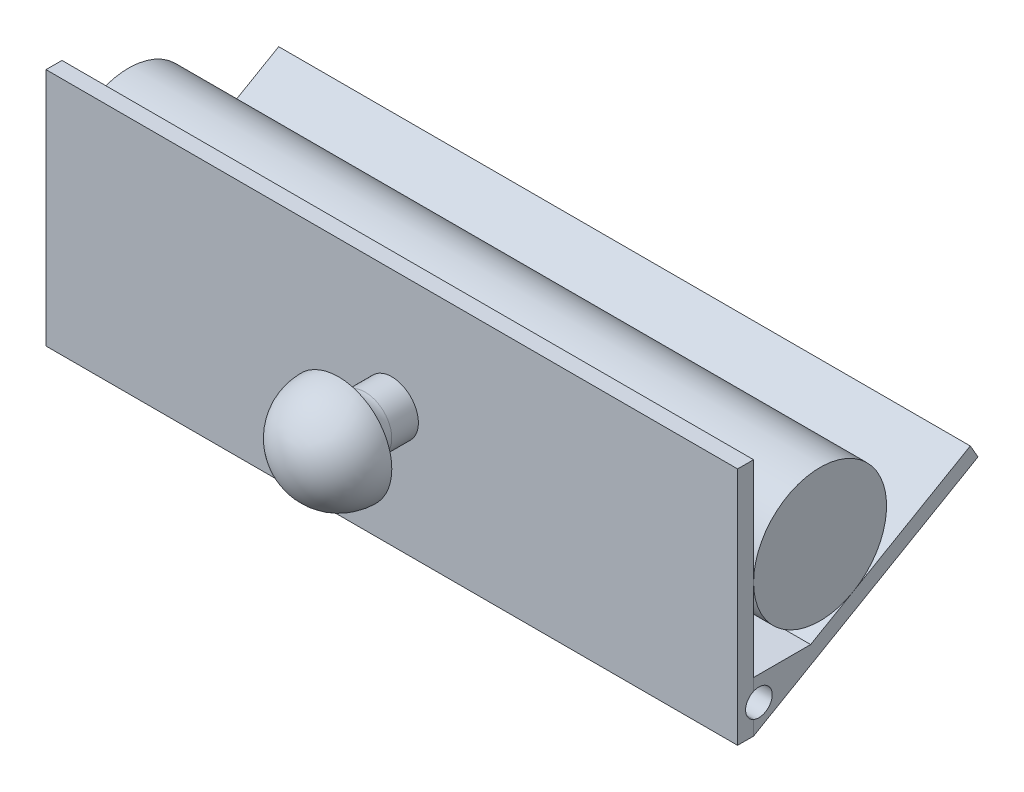
ISO-10303-21;
HEADER;
FILE_DESCRIPTION(('STEP AP214'),'2;1');
FILE_NAME('part.step','',(''),(''),'','','');
FILE_SCHEMA(('AUTOMOTIVE_DESIGN { 1 0 10303 214 1 1 1 1 }'));
ENDSEC;
DATA;
#1=APPLICATION_CONTEXT('core data for automotive mechanical design processes');
#2=APPLICATION_PROTOCOL_DEFINITION('international standard','automotive_design',2000,#1);
#3=PRODUCT_CONTEXT('',#1,'mechanical');
#4=PRODUCT('Part','Part','',(#3));
#5=PRODUCT_RELATED_PRODUCT_CATEGORY('part','',(#4));
#6=PRODUCT_DEFINITION_FORMATION('','',#4);
#7=PRODUCT_DEFINITION_CONTEXT('part definition',#1,'design');
#8=PRODUCT_DEFINITION('design','',#6,#7);
#9=PRODUCT_DEFINITION_SHAPE('','',#8);
#10=(LENGTH_UNIT() NAMED_UNIT(*) SI_UNIT(.MILLI.,.METRE.));
#11=(NAMED_UNIT(*) PLANE_ANGLE_UNIT() SI_UNIT($,.RADIAN.));
#12=(NAMED_UNIT(*) SI_UNIT($,.STERADIAN.) SOLID_ANGLE_UNIT());
#13=UNCERTAINTY_MEASURE_WITH_UNIT(LENGTH_MEASURE(1.E-05),#10,'distance_accuracy_value','');
#14=(GEOMETRIC_REPRESENTATION_CONTEXT(3) GLOBAL_UNCERTAINTY_ASSIGNED_CONTEXT((#13)) GLOBAL_UNIT_ASSIGNED_CONTEXT((#10,
#11,#12)) REPRESENTATION_CONTEXT('',''));
#15=CARTESIAN_POINT('',(0.,0.,0.));
#16=DIRECTION('',(0.,0.,1.));
#17=DIRECTION('',(1.,0.,0.));
#18=AXIS2_PLACEMENT_3D('',#15,#16,#17);
#19=CARTESIAN_POINT('',(130.,0.,0.));
#20=DIRECTION('',(0.,0.,-1.));
#21=DIRECTION('',(-1.,0.,0.));
#22=AXIS2_PLACEMENT_3D('',#19,#20,#21);
#23=PLANE('',#22);
#24=DIRECTION('',(0.,-1.,0.));
#25=VECTOR('',#24,1.);
#26=CARTESIAN_POINT('',(130.,0.,0.));
#27=LINE('',#26,#25);
#28=CARTESIAN_POINT('',(130.,2.70871215252208,0.));
#29=VERTEX_POINT('',#28);
#30=CARTESIAN_POINT('',(130.,0.,0.));
#31=VERTEX_POINT('',#30);
#32=EDGE_CURVE('E145',#29,#31,#27,.T.);
#33=ORIENTED_EDGE('',*,*,#32,.F.);
#34=DIRECTION('',(-1.,0.,0.));
#35=VECTOR('',#34,1.);
#36=CARTESIAN_POINT('',(130.,2.70871215252208,0.));
#37=LINE('',#36,#35);
#38=CARTESIAN_POINT('',(0.,2.70871215252208,0.));
#39=VERTEX_POINT('',#38);
#40=EDGE_CURVE('E172',#29,#39,#37,.T.);
#41=ORIENTED_EDGE('',*,*,#40,.T.);
#42=DIRECTION('',(0.,-1.,0.));
#43=VECTOR('',#42,1.);
#44=CARTESIAN_POINT('',(0.,0.,0.));
#45=LINE('',#44,#43);
#46=CARTESIAN_POINT('',(0.,0.,0.));
#47=VERTEX_POINT('',#46);
#48=EDGE_CURVE('E178',#39,#47,#45,.T.);
#49=ORIENTED_EDGE('',*,*,#48,.T.);
#50=DIRECTION('',(-1.,0.,0.));
#51=VECTOR('',#50,1.);
#52=CARTESIAN_POINT('',(130.,0.,0.));
#53=LINE('',#52,#51);
#54=EDGE_CURVE('E81',#31,#47,#53,.T.);
#55=ORIENTED_EDGE('',*,*,#54,.F.);
#56=EDGE_LOOP('',(#33,#41,#49,#55));
#57=FACE_BOUND('',#56,.T.);
#58=ADVANCED_FACE('F72',(#57),#23,.F.);
#59=CARTESIAN_POINT('',(130.,9.54475687595348,2.51508875120513E-13));
#60=DIRECTION('',(0.,-1.,0.));
#61=DIRECTION('',(0.,0.,-1.));
#62=AXIS2_PLACEMENT_3D('',#59,#60,#61);
#63=PLANE('',#62);
#64=DIRECTION('',(0.,0.,1.));
#65=VECTOR('',#64,1.);
#66=CARTESIAN_POINT('',(0.,9.54475687595348,2.51508875120513E-13));
#67=LINE('',#66,#65);
#68=CARTESIAN_POINT('',(0.,9.54475687595376,-10.7307336658225));
#69=VERTEX_POINT('',#68);
#70=CARTESIAN_POINT('',(0.,9.54475687595362,0.));
#71=VERTEX_POINT('',#70);
#72=EDGE_CURVE('E168',#69,#71,#67,.T.);
#73=ORIENTED_EDGE('',*,*,#72,.T.);
#74=DIRECTION('',(-1.,0.,0.));
#75=VECTOR('',#74,1.);
#76=CARTESIAN_POINT('',(130.,9.54475687595362,0.));
#77=LINE('',#76,#75);
#78=CARTESIAN_POINT('',(130.,9.54475687595362,0.));
#79=VERTEX_POINT('',#78);
#80=EDGE_CURVE('E13',#79,#71,#77,.T.);
#81=ORIENTED_EDGE('',*,*,#80,.F.);
#82=DIRECTION('',(0.,0.,1.));
#83=VECTOR('',#82,1.);
#84=CARTESIAN_POINT('',(130.,9.54475687595348,2.51508875120513E-13));
#85=LINE('',#84,#83);
#86=CARTESIAN_POINT('',(130.,9.54475687595376,-10.7307336658225));
#87=VERTEX_POINT('',#86);
#88=EDGE_CURVE('E163',#87,#79,#85,.T.);
#89=ORIENTED_EDGE('',*,*,#88,.F.);
#90=DIRECTION('',(-1.,0.,0.));
#91=VECTOR('',#90,1.);
#92=CARTESIAN_POINT('',(130.,9.54475687595376,-10.7307336658225));
#93=LINE('',#92,#91);
#94=EDGE_CURVE('E76',#87,#69,#93,.T.);
#95=ORIENTED_EDGE('',*,*,#94,.T.);
#96=EDGE_LOOP('',(#73,#81,#89,#95));
#97=FACE_BOUND('',#96,.T.);
#98=ADVANCED_FACE('F74',(#97),#63,.F.);
#99=CARTESIAN_POINT('',(0.,7.29128784747792,0.));
#100=VERTEX_POINT('',#99);
#101=EDGE_CURVE('E121',#71,#100,#45,.T.);
#102=ORIENTED_EDGE('',*,*,#101,.T.);
#103=DIRECTION('',(-1.,0.,0.));
#104=VECTOR('',#103,1.);
#105=CARTESIAN_POINT('',(130.,7.29128784747792,0.));
#106=LINE('',#105,#104);
#107=CARTESIAN_POINT('',(130.,7.29128784747792,0.));
#108=VERTEX_POINT('',#107);
#109=EDGE_CURVE('E89',#100,#108,#106,.F.);
#110=ORIENTED_EDGE('',*,*,#109,.T.);
#111=EDGE_CURVE('E96',#79,#108,#27,.T.);
#112=ORIENTED_EDGE('',*,*,#111,.F.);
#113=ORIENTED_EDGE('',*,*,#80,.T.);
#114=EDGE_LOOP('',(#102,#110,#112,#113));
#115=FACE_BOUND('',#114,.T.);
#116=ADVANCED_FACE('F194',(#115),#23,.F.);
#117=CARTESIAN_POINT('',(130.,0.,0.));
#118=DIRECTION('',(0.,0.866025403784436,0.500000000000004));
#119=DIRECTION('',(0.,-0.500000000000004,0.866025403784436));
#120=AXIS2_PLACEMENT_3D('',#117,#118,#119);
#121=PLANE('',#120);
#122=DIRECTION('',(0.,0.500000000000004,-0.866025403784436));
#123=VECTOR('',#122,1.);
#124=CARTESIAN_POINT('',(0.,0.,0.));
#125=LINE('',#124,#123);
#126=CARTESIAN_POINT('',(0.,24.3572454855254,-42.1879867133573));
#127=VERTEX_POINT('',#126);
#128=EDGE_CURVE('E154',#47,#127,#125,.T.);
#129=ORIENTED_EDGE('',*,*,#128,.T.);
#130=DIRECTION('',(-1.,0.,0.));
#131=VECTOR('',#130,1.);
#132=CARTESIAN_POINT('',(130.,24.3572454855254,-42.1879867133573));
#133=LINE('',#132,#131);
#134=CARTESIAN_POINT('',(130.,24.3572454855254,-42.1879867133573));
#135=VERTEX_POINT('',#134);
#136=EDGE_CURVE('E151',#135,#127,#133,.T.);
#137=ORIENTED_EDGE('',*,*,#136,.F.);
#138=DIRECTION('',(0.,0.500000000000004,-0.866025403784436));
#139=VECTOR('',#138,1.);
#140=CARTESIAN_POINT('',(130.,0.,0.));
#141=LINE('',#140,#139);
#142=EDGE_CURVE('E137',#31,#135,#141,.T.);
#143=ORIENTED_EDGE('',*,*,#142,.F.);
#144=ORIENTED_EDGE('',*,*,#54,.T.);
#145=EDGE_LOOP('',(#129,#137,#143,#144));
#146=FACE_BOUND('',#145,.T.);
#147=ADVANCED_FACE('F152',(#146),#121,.F.);
#148=CARTESIAN_POINT('',(130.,24.3572454855254,-42.1879867133573));
#149=DIRECTION('',(0.,0.500000000000003,-0.866025403784437));
#150=DIRECTION('',(0.,0.866025403784437,0.500000000000003));
#151=AXIS2_PLACEMENT_3D('',#148,#149,#150);
#152=PLANE('',#151);
#153=DIRECTION('',(0.,-0.866025403784437,-0.500000000000003));
#154=VECTOR('',#153,1.);
#155=CARTESIAN_POINT('',(0.,24.3572454855254,-42.1879867133573));
#156=LINE('',#155,#154);
#157=CARTESIAN_POINT('',(0.,26.8692691645671,-40.7376691660519));
#158=VERTEX_POINT('',#157);
#159=EDGE_CURVE('E175',#158,#127,#156,.T.);
#160=ORIENTED_EDGE('',*,*,#159,.F.);
#161=DIRECTION('',(-1.,0.,0.));
#162=VECTOR('',#161,1.);
#163=CARTESIAN_POINT('',(130.,26.8692691645671,-40.7376691660519));
#164=LINE('',#163,#162);
#165=CARTESIAN_POINT('',(130.,26.8692691645671,-40.7376691660519));
#166=VERTEX_POINT('',#165);
#167=EDGE_CURVE('E158',#166,#158,#164,.T.);
#168=ORIENTED_EDGE('',*,*,#167,.F.);
#169=DIRECTION('',(0.,-0.866025403784437,-0.500000000000003));
#170=VECTOR('',#169,1.);
#171=CARTESIAN_POINT('',(130.,24.3572454855254,-42.1879867133573));
#172=LINE('',#171,#170);
#173=EDGE_CURVE('E142',#166,#135,#172,.T.);
#174=ORIENTED_EDGE('',*,*,#173,.T.);
#175=ORIENTED_EDGE('',*,*,#136,.T.);
#176=EDGE_LOOP('',(#160,#168,#174,#175));
#177=FACE_BOUND('',#176,.T.);
#178=ADVANCED_FACE('F160',(#177),#152,.T.);
#179=CARTESIAN_POINT('',(130.,2.51202367904168,1.45031754730544));
#180=DIRECTION('',(0.,0.866025403784436,0.500000000000004));
#181=DIRECTION('',(0.,-0.500000000000004,0.866025403784436));
#182=AXIS2_PLACEMENT_3D('',#179,#180,#181);
#183=PLANE('',#182);
#184=DIRECTION('',(0.,0.500000000000004,-0.866025403784436));
#185=VECTOR('',#184,1.);
#186=CARTESIAN_POINT('',(0.,2.51202367904168,1.45031754730544));
#187=LINE('',#186,#185);
#188=EDGE_CURVE('E171',#69,#158,#187,.T.);
#189=ORIENTED_EDGE('',*,*,#188,.F.);
#190=ORIENTED_EDGE('',*,*,#94,.F.);
#191=DIRECTION('',(0.,0.500000000000004,-0.866025403784436));
#192=VECTOR('',#191,1.);
#193=CARTESIAN_POINT('',(130.,2.51202367904168,1.45031754730544));
#194=LINE('',#193,#192);
#195=EDGE_CURVE('E161',#87,#166,#194,.T.);
#196=ORIENTED_EDGE('',*,*,#195,.T.);
#197=ORIENTED_EDGE('',*,*,#167,.T.);
#198=EDGE_LOOP('',(#189,#190,#196,#197));
#199=FACE_BOUND('',#198,.T.);
#200=ADVANCED_FACE('F183',(#199),#183,.T.);
#201=CARTESIAN_POINT('',(130.,0.,0.));
#202=DIRECTION('',(-1.,0.,0.));
#203=DIRECTION('',(0.,0.,1.));
#204=AXIS2_PLACEMENT_3D('',#201,#202,#203);
#205=PLANE('',#204);
#206=ORIENTED_EDGE('',*,*,#111,.T.);
#207=CARTESIAN_POINT('',(130.,5.,-1.));
#208=DIRECTION('',(-1.,0.,0.));
#209=DIRECTION('',(0.,0.,1.));
#210=AXIS2_PLACEMENT_3D('',#207,#208,#209);
#211=CIRCLE('',#210,2.5);
#212=EDGE_CURVE('E207',#108,#29,#211,.T.);
#213=ORIENTED_EDGE('',*,*,#212,.T.);
#214=ORIENTED_EDGE('',*,*,#32,.T.);
#215=ORIENTED_EDGE('',*,*,#142,.T.);
#216=ORIENTED_EDGE('',*,*,#173,.F.);
#217=ORIENTED_EDGE('',*,*,#195,.F.);
#218=ORIENTED_EDGE('',*,*,#88,.T.);
#219=EDGE_LOOP('',(#206,#213,#214,#215,#216,#217,#218));
#220=FACE_BOUND('',#219,.T.);
#221=ADVANCED_FACE('F139',(#220),#205,.F.);
#222=CARTESIAN_POINT('',(0.,0.,0.));
#223=DIRECTION('',(-1.,0.,0.));
#224=DIRECTION('',(0.,0.,1.));
#225=AXIS2_PLACEMENT_3D('',#222,#223,#224);
#226=PLANE('',#225);
#227=CARTESIAN_POINT('',(0.,5.,-1.));
#228=DIRECTION('',(-1.,0.,0.));
#229=DIRECTION('',(0.,0.,1.));
#230=AXIS2_PLACEMENT_3D('',#227,#228,#229);
#231=CIRCLE('',#230,2.5);
#232=EDGE_CURVE('E212',#100,#39,#231,.T.);
#233=ORIENTED_EDGE('',*,*,#232,.F.);
#234=ORIENTED_EDGE('',*,*,#101,.F.);
#235=ORIENTED_EDGE('',*,*,#72,.F.);
#236=ORIENTED_EDGE('',*,*,#188,.T.);
#237=ORIENTED_EDGE('',*,*,#159,.T.);
#238=ORIENTED_EDGE('',*,*,#128,.F.);
#239=ORIENTED_EDGE('',*,*,#48,.F.);
#240=EDGE_LOOP('',(#233,#234,#235,#236,#237,#238,#239));
#241=FACE_BOUND('',#240,.T.);
#242=ADVANCED_FACE('F182',(#241),#226,.T.);
#243=CARTESIAN_POINT('',(130.,5.,-1.));
#244=DIRECTION('',(-1.,0.,0.));
#245=DIRECTION('',(0.,0.,1.));
#246=AXIS2_PLACEMENT_3D('',#243,#244,#245);
#247=CYLINDRICAL_SURFACE('',#246,2.5);
#248=ORIENTED_EDGE('',*,*,#212,.F.);
#249=ORIENTED_EDGE('',*,*,#109,.F.);
#250=ORIENTED_EDGE('',*,*,#232,.T.);
#251=ORIENTED_EDGE('',*,*,#40,.F.);
#252=EDGE_LOOP('',(#248,#249,#250,#251));
#253=FACE_BOUND('',#252,.T.);
#254=ADVANCED_FACE('F215',(#253),#247,.F.);
#255=CLOSED_SHELL('',(#58,#98,#116,#147,#178,#200,#221,#242,#254));
#256=MANIFOLD_SOLID_BREP('B2',#255);
#257=CARTESIAN_POINT('',(130.,25.,-12.5));
#258=DIRECTION('',(-1.,0.,0.));
#259=DIRECTION('',(0.,0.,1.));
#260=AXIS2_PLACEMENT_3D('',#257,#258,#259);
#261=CYLINDRICAL_SURFACE('',#260,12.5);
#262=CARTESIAN_POINT('',(130.,25.,-12.5));
#263=DIRECTION('',(-1.,0.,0.));
#264=DIRECTION('',(0.,0.,1.));
#265=AXIS2_PLACEMENT_3D('',#262,#263,#264);
#266=CIRCLE('',#265,12.5);
#267=CARTESIAN_POINT('',(130.,25.,0.));
#268=VERTEX_POINT('',#267);
#269=EDGE_CURVE('E71',#268,#268,#266,.T.);
#270=ORIENTED_EDGE('',*,*,#269,.T.);
#271=EDGE_LOOP('',(#270));
#272=FACE_BOUND('',#271,.T.);
#273=CARTESIAN_POINT('',(0.,25.,-12.5));
#274=DIRECTION('',(-1.,0.,0.));
#275=DIRECTION('',(0.,0.,1.));
#276=AXIS2_PLACEMENT_3D('',#273,#274,#275);
#277=CIRCLE('',#276,12.5);
#278=CARTESIAN_POINT('',(0.,25.,0.));
#279=VERTEX_POINT('',#278);
#280=EDGE_CURVE('E289',#279,#279,#277,.T.);
#281=ORIENTED_EDGE('',*,*,#280,.F.);
#282=EDGE_LOOP('',(#281));
#283=FACE_BOUND('',#282,.T.);
#284=ADVANCED_FACE('F286',(#272,#283),#261,.T.);
#285=CARTESIAN_POINT('',(130.,0.,0.));
#286=DIRECTION('',(-1.,0.,0.));
#287=DIRECTION('',(0.,0.,1.));
#288=AXIS2_PLACEMENT_3D('',#285,#286,#287);
#289=PLANE('',#288);
#290=ORIENTED_EDGE('',*,*,#269,.F.);
#291=EDGE_LOOP('',(#290));
#292=FACE_BOUND('',#291,.T.);
#293=ADVANCED_FACE('F301',(#292),#289,.F.);
#294=CARTESIAN_POINT('',(0.,0.,0.));
#295=DIRECTION('',(-1.,0.,0.));
#296=DIRECTION('',(0.,0.,1.));
#297=AXIS2_PLACEMENT_3D('',#294,#295,#296);
#298=PLANE('',#297);
#299=ORIENTED_EDGE('',*,*,#280,.T.);
#300=EDGE_LOOP('',(#299));
#301=FACE_BOUND('',#300,.T.);
#302=ADVANCED_FACE('F298',(#301),#298,.T.);
#303=CLOSED_SHELL('',(#284,#293,#302));
#304=MANIFOLD_SOLID_BREP('B7',#303);
#305=CARTESIAN_POINT('',(0.,0.,0.));
#306=DIRECTION('',(0.,0.,-1.));
#307=DIRECTION('',(-1.,0.,0.));
#308=AXIS2_PLACEMENT_3D('',#305,#306,#307);
#309=PLANE('',#308);
#310=DIRECTION('',(-1.,0.,0.));
#311=VECTOR('',#310,1.);
#312=CARTESIAN_POINT('',(130.,2.70871215252208,0.));
#313=LINE('',#312,#311);
#314=CARTESIAN_POINT('',(130.,2.70871215252208,0.));
#315=VERTEX_POINT('',#314);
#316=CARTESIAN_POINT('',(0.,2.70871215252208,0.));
#317=VERTEX_POINT('',#316);
#318=EDGE_CURVE('E284',#315,#317,#313,.T.);
#319=ORIENTED_EDGE('',*,*,#318,.F.);
#320=DIRECTION('',(0.,1.,0.));
#321=VECTOR('',#320,1.);
#322=CARTESIAN_POINT('',(130.,0.,0.));
#323=LINE('',#322,#321);
#324=CARTESIAN_POINT('',(130.,0.,0.));
#325=VERTEX_POINT('',#324);
#326=EDGE_CURVE('E414',#325,#315,#323,.T.);
#327=ORIENTED_EDGE('',*,*,#326,.F.);
#328=DIRECTION('',(1.,0.,0.));
#329=VECTOR('',#328,1.);
#330=CARTESIAN_POINT('',(0.,0.,0.));
#331=LINE('',#330,#329);
#332=CARTESIAN_POINT('',(0.,0.,0.));
#333=VERTEX_POINT('',#332);
#334=EDGE_CURVE('E403',#333,#325,#331,.T.);
#335=ORIENTED_EDGE('',*,*,#334,.F.);
#336=DIRECTION('',(0.,-1.,0.));
#337=VECTOR('',#336,1.);
#338=CARTESIAN_POINT('',(0.,0.,0.));
#339=LINE('',#338,#337);
#340=EDGE_CURVE('E398',#317,#333,#339,.T.);
#341=ORIENTED_EDGE('',*,*,#340,.F.);
#342=EDGE_LOOP('',(#319,#327,#335,#341));
#343=FACE_BOUND('',#342,.T.);
#344=ADVANCED_FACE('F327',(#343),#309,.T.);
#345=CARTESIAN_POINT('',(0.,0.,3.));
#346=DIRECTION('',(1.,0.,0.));
#347=DIRECTION('',(0.,0.,-1.));
#348=AXIS2_PLACEMENT_3D('',#345,#346,#347);
#349=PLANE('',#348);
#350=CARTESIAN_POINT('',(0.,45.,0.));
#351=VERTEX_POINT('',#350);
#352=CARTESIAN_POINT('',(0.,7.29128784747792,0.));
#353=VERTEX_POINT('',#352);
#354=EDGE_CURVE('E401',#351,#353,#339,.T.);
#355=ORIENTED_EDGE('',*,*,#354,.T.);
#356=CARTESIAN_POINT('',(0.,5.,-1.));
#357=DIRECTION('',(-1.,0.,0.));
#358=DIRECTION('',(0.,0.,1.));
#359=AXIS2_PLACEMENT_3D('',#356,#357,#358);
#360=CIRCLE('',#359,2.5);
#361=EDGE_CURVE('E341',#317,#353,#360,.T.);
#362=ORIENTED_EDGE('',*,*,#361,.F.);
#363=ORIENTED_EDGE('',*,*,#340,.T.);
#364=DIRECTION('',(0.,0.,-1.));
#365=VECTOR('',#364,1.);
#366=CARTESIAN_POINT('',(0.,0.,3.));
#367=LINE('',#366,#365);
#368=CARTESIAN_POINT('',(0.,0.,3.));
#369=VERTEX_POINT('',#368);
#370=EDGE_CURVE('E425',#369,#333,#367,.T.);
#371=ORIENTED_EDGE('',*,*,#370,.F.);
#372=DIRECTION('',(0.,-1.,0.));
#373=VECTOR('',#372,1.);
#374=CARTESIAN_POINT('',(0.,0.,3.));
#375=LINE('',#374,#373);
#376=CARTESIAN_POINT('',(0.,45.,3.));
#377=VERTEX_POINT('',#376);
#378=EDGE_CURVE('E417',#377,#369,#375,.T.);
#379=ORIENTED_EDGE('',*,*,#378,.F.);
#380=DIRECTION('',(0.,0.,-1.));
#381=VECTOR('',#380,1.);
#382=CARTESIAN_POINT('',(0.,45.,3.));
#383=LINE('',#382,#381);
#384=EDGE_CURVE('E418',#377,#351,#383,.T.);
#385=ORIENTED_EDGE('',*,*,#384,.T.);
#386=EDGE_LOOP('',(#355,#362,#363,#371,#379,#385));
#387=FACE_BOUND('',#386,.T.);
#388=ADVANCED_FACE('F396',(#387),#349,.F.);
#389=CARTESIAN_POINT('',(0.,0.,3.));
#390=DIRECTION('',(0.,1.,0.));
#391=DIRECTION('',(0.,0.,1.));
#392=AXIS2_PLACEMENT_3D('',#389,#390,#391);
#393=PLANE('',#392);
#394=ORIENTED_EDGE('',*,*,#334,.T.);
#395=DIRECTION('',(0.,0.,-1.));
#396=VECTOR('',#395,1.);
#397=CARTESIAN_POINT('',(130.,0.,3.));
#398=LINE('',#397,#396);
#399=CARTESIAN_POINT('',(130.,0.,3.));
#400=VERTEX_POINT('',#399);
#401=EDGE_CURVE('E422',#400,#325,#398,.T.);
#402=ORIENTED_EDGE('',*,*,#401,.F.);
#403=DIRECTION('',(1.,0.,0.));
#404=VECTOR('',#403,1.);
#405=CARTESIAN_POINT('',(0.,0.,3.));
#406=LINE('',#405,#404);
#407=EDGE_CURVE('E379',#369,#400,#406,.T.);
#408=ORIENTED_EDGE('',*,*,#407,.F.);
#409=ORIENTED_EDGE('',*,*,#370,.T.);
#410=EDGE_LOOP('',(#394,#402,#408,#409));
#411=FACE_BOUND('',#410,.T.);
#412=ADVANCED_FACE('F454',(#411),#393,.F.);
#413=CARTESIAN_POINT('',(130.,0.,3.));
#414=DIRECTION('',(-1.,0.,0.));
#415=DIRECTION('',(0.,0.,1.));
#416=AXIS2_PLACEMENT_3D('',#413,#414,#415);
#417=PLANE('',#416);
#418=ORIENTED_EDGE('',*,*,#326,.T.);
#419=CARTESIAN_POINT('',(130.,5.,-1.));
#420=DIRECTION('',(-1.,0.,0.));
#421=DIRECTION('',(0.,0.,1.));
#422=AXIS2_PLACEMENT_3D('',#419,#420,#421);
#423=CIRCLE('',#422,2.5);
#424=CARTESIAN_POINT('',(130.,7.29128784747792,0.));
#425=VERTEX_POINT('',#424);
#426=EDGE_CURVE('E389',#315,#425,#423,.T.);
#427=ORIENTED_EDGE('',*,*,#426,.T.);
#428=CARTESIAN_POINT('',(130.,45.,0.));
#429=VERTEX_POINT('',#428);
#430=EDGE_CURVE('E413',#425,#429,#323,.T.);
#431=ORIENTED_EDGE('',*,*,#430,.T.);
#432=DIRECTION('',(0.,0.,-1.));
#433=VECTOR('',#432,1.);
#434=CARTESIAN_POINT('',(130.,45.,3.));
#435=LINE('',#434,#433);
#436=CARTESIAN_POINT('',(130.,45.,3.));
#437=VERTEX_POINT('',#436);
#438=EDGE_CURVE('E420',#437,#429,#435,.T.);
#439=ORIENTED_EDGE('',*,*,#438,.F.);
#440=DIRECTION('',(0.,1.,0.));
#441=VECTOR('',#440,1.);
#442=CARTESIAN_POINT('',(130.,0.,3.));
#443=LINE('',#442,#441);
#444=EDGE_CURVE('E477',#400,#437,#443,.T.);
#445=ORIENTED_EDGE('',*,*,#444,.F.);
#446=ORIENTED_EDGE('',*,*,#401,.T.);
#447=EDGE_LOOP('',(#418,#427,#431,#439,#445,#446));
#448=FACE_BOUND('',#447,.T.);
#449=ADVANCED_FACE('F432',(#448),#417,.F.);
#450=CARTESIAN_POINT('',(0.,45.,3.));
#451=DIRECTION('',(0.,-1.,0.));
#452=DIRECTION('',(0.,0.,-1.));
#453=AXIS2_PLACEMENT_3D('',#450,#451,#452);
#454=PLANE('',#453);
#455=DIRECTION('',(-1.,0.,0.));
#456=VECTOR('',#455,1.);
#457=CARTESIAN_POINT('',(0.,45.,0.));
#458=LINE('',#457,#456);
#459=EDGE_CURVE('E371',#429,#351,#458,.T.);
#460=ORIENTED_EDGE('',*,*,#459,.T.);
#461=ORIENTED_EDGE('',*,*,#384,.F.);
#462=DIRECTION('',(-1.,0.,0.));
#463=VECTOR('',#462,1.);
#464=CARTESIAN_POINT('',(0.,45.,3.));
#465=LINE('',#464,#463);
#466=EDGE_CURVE('E350',#437,#377,#465,.T.);
#467=ORIENTED_EDGE('',*,*,#466,.F.);
#468=ORIENTED_EDGE('',*,*,#438,.T.);
#469=EDGE_LOOP('',(#460,#461,#467,#468));
#470=FACE_BOUND('',#469,.T.);
#471=ADVANCED_FACE('F447',(#470),#454,.F.);
#472=CARTESIAN_POINT('',(0.,0.,3.));
#473=DIRECTION('',(0.,0.,-1.));
#474=DIRECTION('',(-1.,0.,0.));
#475=AXIS2_PLACEMENT_3D('',#472,#473,#474);
#476=PLANE('',#475);
#477=ORIENTED_EDGE('',*,*,#378,.T.);
#478=ORIENTED_EDGE('',*,*,#407,.T.);
#479=ORIENTED_EDGE('',*,*,#444,.T.);
#480=ORIENTED_EDGE('',*,*,#466,.T.);
#481=EDGE_LOOP('',(#477,#478,#479,#480));
#482=FACE_BOUND('',#481,.T.);
#483=CARTESIAN_POINT('',(65.,22.5,3.));
#484=DIRECTION('',(0.,0.,-1.));
#485=DIRECTION('',(-1.,0.,0.));
#486=AXIS2_PLACEMENT_3D('',#483,#484,#485);
#487=CIRCLE('',#486,5.);
#488=CARTESIAN_POINT('',(60.,22.5,3.));
#489=VERTEX_POINT('',#488);
#490=EDGE_CURVE('E407',#489,#489,#487,.T.);
#491=ORIENTED_EDGE('',*,*,#490,.T.);
#492=EDGE_LOOP('',(#491));
#493=FACE_BOUND('',#492,.T.);
#494=ADVANCED_FACE('F438',(#482,#493),#476,.F.);
#495=DIRECTION('',(-1.,0.,0.));
#496=VECTOR('',#495,1.);
#497=CARTESIAN_POINT('',(130.,7.29128784747792,0.));
#498=LINE('',#497,#496);
#499=EDGE_CURVE('E335',#353,#425,#498,.F.);
#500=ORIENTED_EDGE('',*,*,#499,.F.);
#501=ORIENTED_EDGE('',*,*,#354,.F.);
#502=ORIENTED_EDGE('',*,*,#459,.F.);
#503=ORIENTED_EDGE('',*,*,#430,.F.);
#504=EDGE_LOOP('',(#500,#501,#502,#503));
#505=FACE_BOUND('',#504,.T.);
#506=ADVANCED_FACE('F435',(#505),#309,.T.);
#507=CARTESIAN_POINT('',(65.,22.5,13.));
#508=DIRECTION('',(0.,0.,-1.));
#509=DIRECTION('',(-1.,0.,0.));
#510=AXIS2_PLACEMENT_3D('',#507,#508,#509);
#511=CYLINDRICAL_SURFACE('',#510,5.);
#512=CARTESIAN_POINT('',(65.,22.5,8.));
#513=DIRECTION('',(0.,0.,-1.));
#514=DIRECTION('',(-1.,0.,0.));
#515=AXIS2_PLACEMENT_3D('',#512,#513,#514);
#516=CIRCLE('',#515,5.);
#517=CARTESIAN_POINT('',(60.,22.5,8.));
#518=VERTEX_POINT('',#517);
#519=EDGE_CURVE('E427',#518,#518,#516,.T.);
#520=ORIENTED_EDGE('',*,*,#519,.T.);
#521=EDGE_LOOP('',(#520));
#522=FACE_BOUND('',#521,.T.);
#523=ORIENTED_EDGE('',*,*,#490,.F.);
#524=EDGE_LOOP('',(#523));
#525=FACE_BOUND('',#524,.T.);
#526=ADVANCED_FACE('F437',(#522,#525),#511,.T.);
#527=CARTESIAN_POINT('',(65.,22.5,13.));
#528=DIRECTION('',(0.,0.,1.));
#529=DIRECTION('',(1.,0.,0.));
#530=AXIS2_PLACEMENT_3D('',#527,#528,#529);
#531=SPHERICAL_SURFACE('',#530,10.);
#532=CARTESIAN_POINT('',(65.,22.5,13.));
#533=DIRECTION('',(0.,0.,-1.));
#534=DIRECTION('',(-1.,0.,0.));
#535=AXIS2_PLACEMENT_3D('',#532,#533,#534);
#536=CIRCLE('',#535,9.99999999999999);
#537=CARTESIAN_POINT('',(55.,22.5,13.));
#538=VERTEX_POINT('',#537);
#539=EDGE_CURVE('E404',#538,#538,#536,.T.);
#540=ORIENTED_EDGE('',*,*,#539,.F.);
#541=EDGE_LOOP('',(#540));
#542=FACE_BOUND('',#541,.T.);
#543=ADVANCED_FACE('F444',(#542),#531,.T.);
#544=CARTESIAN_POINT('',(65.,22.5,8.));
#545=DIRECTION('',(0.,0.,-1.));
#546=DIRECTION('',(-1.,0.,0.));
#547=AXIS2_PLACEMENT_3D('',#544,#545,#546);
#548=TOROIDAL_SURFACE('',#547,10.,5.);
#549=ORIENTED_EDGE('',*,*,#539,.T.);
#550=EDGE_LOOP('',(#549));
#551=FACE_BOUND('',#550,.T.);
#552=ORIENTED_EDGE('',*,*,#519,.F.);
#553=EDGE_LOOP('',(#552));
#554=FACE_BOUND('',#553,.T.);
#555=ADVANCED_FACE('F329',(#551,#554),#548,.F.);
#556=CARTESIAN_POINT('',(130.,5.,-1.));
#557=DIRECTION('',(-1.,0.,0.));
#558=DIRECTION('',(0.,0.,1.));
#559=AXIS2_PLACEMENT_3D('',#556,#557,#558);
#560=CYLINDRICAL_SURFACE('',#559,2.5);
#561=ORIENTED_EDGE('',*,*,#318,.T.);
#562=ORIENTED_EDGE('',*,*,#361,.T.);
#563=ORIENTED_EDGE('',*,*,#499,.T.);
#564=ORIENTED_EDGE('',*,*,#426,.F.);
#565=EDGE_LOOP('',(#561,#562,#563,#564));
#566=FACE_BOUND('',#565,.T.);
#567=ADVANCED_FACE('F387',(#566),#560,.F.);
#568=CLOSED_SHELL('',(#344,#388,#412,#449,#471,#494,#506,#526,#543,#555,#567));
#569=MANIFOLD_SOLID_BREP('B66',#568);
#570=ADVANCED_BREP_SHAPE_REPRESENTATION('',(#18,#256,#304,#569),#14);
#571=SHAPE_DEFINITION_REPRESENTATION(#9,#570);
ENDSEC;
END-ISO-10303-21;
